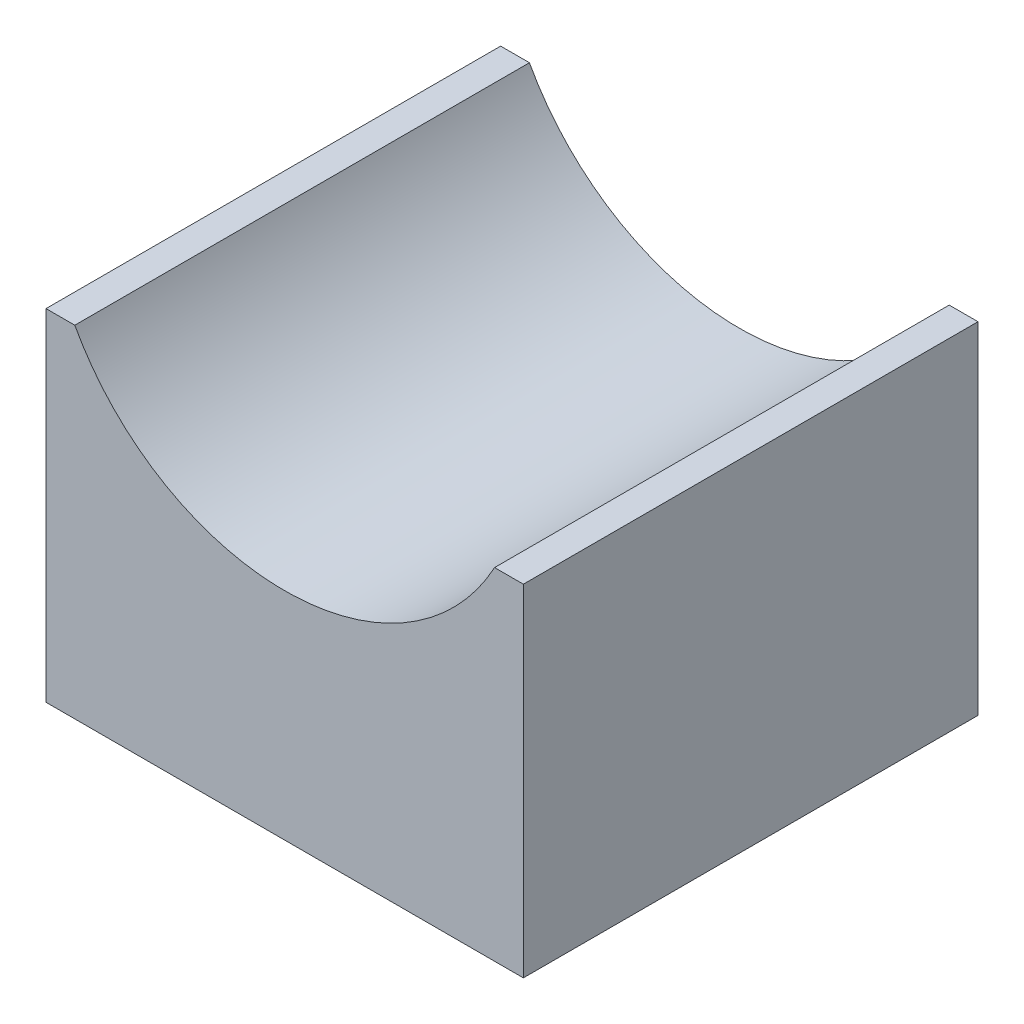
ISO-10303-21;
HEADER;
FILE_DESCRIPTION(('STEP AP214'),'2;1');
FILE_NAME('part.step','',(''),(''),'','','');
FILE_SCHEMA(('AUTOMOTIVE_DESIGN { 1 0 10303 214 1 1 1 1 }'));
ENDSEC;
DATA;
#1=APPLICATION_CONTEXT('core data for automotive mechanical design processes');
#2=APPLICATION_PROTOCOL_DEFINITION('international standard','automotive_design',2000,#1);
#3=PRODUCT_CONTEXT('',#1,'mechanical');
#4=PRODUCT('Part','Part','',(#3));
#5=PRODUCT_RELATED_PRODUCT_CATEGORY('part','',(#4));
#6=PRODUCT_DEFINITION_FORMATION('','',#4);
#7=PRODUCT_DEFINITION_CONTEXT('part definition',#1,'design');
#8=PRODUCT_DEFINITION('design','',#6,#7);
#9=PRODUCT_DEFINITION_SHAPE('','',#8);
#10=(LENGTH_UNIT() NAMED_UNIT(*) SI_UNIT(.MILLI.,.METRE.));
#11=(NAMED_UNIT(*) PLANE_ANGLE_UNIT() SI_UNIT($,.RADIAN.));
#12=(NAMED_UNIT(*) SI_UNIT($,.STERADIAN.) SOLID_ANGLE_UNIT());
#13=UNCERTAINTY_MEASURE_WITH_UNIT(LENGTH_MEASURE(1.E-05),#10,'distance_accuracy_value','');
#14=(GEOMETRIC_REPRESENTATION_CONTEXT(3) GLOBAL_UNCERTAINTY_ASSIGNED_CONTEXT((#13)) GLOBAL_UNIT_ASSIGNED_CONTEXT((#10,
#11,#12)) REPRESENTATION_CONTEXT('',''));
#15=CARTESIAN_POINT('',(0.,0.,0.));
#16=DIRECTION('',(0.,0.,1.));
#17=DIRECTION('',(1.,0.,0.));
#18=AXIS2_PLACEMENT_3D('',#15,#16,#17);
#19=CARTESIAN_POINT('',(0.,20.,10.));
#20=DIRECTION('',(0.,0.,-1.));
#21=DIRECTION('',(-1.,0.,0.));
#22=AXIS2_PLACEMENT_3D('',#19,#20,#21);
#23=CYLINDRICAL_SURFACE('',#22,10.5);
#24=CARTESIAN_POINT('',(0.,20.,-10.));
#25=DIRECTION('',(0.,0.,-1.));
#26=DIRECTION('',(1.,0.,0.));
#27=AXIS2_PLACEMENT_3D('',#24,#25,#26);
#28=CIRCLE('',#27,10.5);
#29=CARTESIAN_POINT('',(9.23309265630969,15.,-10.));
#30=VERTEX_POINT('',#29);
#31=CARTESIAN_POINT('',(-9.23309265630969,15.,-10.));
#32=VERTEX_POINT('',#31);
#33=EDGE_CURVE('E125',#30,#32,#28,.T.);
#34=ORIENTED_EDGE('',*,*,#33,.T.);
#35=DIRECTION('',(0.,0.,-1.));
#36=VECTOR('',#35,1.);
#37=CARTESIAN_POINT('',(-9.23309265630969,15.,10.));
#38=LINE('',#37,#36);
#39=CARTESIAN_POINT('',(-9.23309265630969,15.,10.));
#40=VERTEX_POINT('',#39);
#41=EDGE_CURVE('E11',#40,#32,#38,.T.);
#42=ORIENTED_EDGE('',*,*,#41,.F.);
#43=CARTESIAN_POINT('',(0.,20.,10.));
#44=DIRECTION('',(0.,0.,-1.));
#45=DIRECTION('',(1.,0.,0.));
#46=AXIS2_PLACEMENT_3D('',#43,#44,#45);
#47=CIRCLE('',#46,10.5);
#48=CARTESIAN_POINT('',(9.23309265630969,15.,10.));
#49=VERTEX_POINT('',#48);
#50=EDGE_CURVE('E135',#49,#40,#47,.T.);
#51=ORIENTED_EDGE('',*,*,#50,.F.);
#52=DIRECTION('',(0.,0.,-1.));
#53=VECTOR('',#52,1.);
#54=CARTESIAN_POINT('',(9.23309265630969,15.,10.));
#55=LINE('',#54,#53);
#56=EDGE_CURVE('E121',#49,#30,#55,.T.);
#57=ORIENTED_EDGE('',*,*,#56,.T.);
#58=EDGE_LOOP('',(#34,#42,#51,#57));
#59=FACE_BOUND('',#58,.T.);
#60=ADVANCED_FACE('F41',(#59),#23,.F.);
#61=CARTESIAN_POINT('',(-10.5,15.,10.));
#62=DIRECTION('',(0.,-1.,0.));
#63=DIRECTION('',(0.,0.,-1.));
#64=AXIS2_PLACEMENT_3D('',#61,#62,#63);
#65=PLANE('',#64);
#66=DIRECTION('',(-1.,0.,0.));
#67=VECTOR('',#66,1.);
#68=CARTESIAN_POINT('',(-10.5,15.,-10.));
#69=LINE('',#68,#67);
#70=CARTESIAN_POINT('',(-10.5,15.,-10.));
#71=VERTEX_POINT('',#70);
#72=EDGE_CURVE('E128',#32,#71,#69,.T.);
#73=ORIENTED_EDGE('',*,*,#72,.T.);
#74=DIRECTION('',(0.,0.,-1.));
#75=VECTOR('',#74,1.);
#76=CARTESIAN_POINT('',(-10.5,15.,10.));
#77=LINE('',#76,#75);
#78=CARTESIAN_POINT('',(-10.5,15.,10.));
#79=VERTEX_POINT('',#78);
#80=EDGE_CURVE('E49',#79,#71,#77,.T.);
#81=ORIENTED_EDGE('',*,*,#80,.F.);
#82=DIRECTION('',(-1.,0.,0.));
#83=VECTOR('',#82,1.);
#84=CARTESIAN_POINT('',(-10.5,15.,10.));
#85=LINE('',#84,#83);
#86=EDGE_CURVE('E94',#40,#79,#85,.T.);
#87=ORIENTED_EDGE('',*,*,#86,.F.);
#88=ORIENTED_EDGE('',*,*,#41,.T.);
#89=EDGE_LOOP('',(#73,#81,#87,#88));
#90=FACE_BOUND('',#89,.T.);
#91=ADVANCED_FACE('F159',(#90),#65,.F.);
#92=CARTESIAN_POINT('',(-10.5,15.,10.));
#93=DIRECTION('',(1.,0.,0.));
#94=DIRECTION('',(0.,0.,-1.));
#95=AXIS2_PLACEMENT_3D('',#92,#93,#94);
#96=PLANE('',#95);
#97=DIRECTION('',(0.,-1.,0.));
#98=VECTOR('',#97,1.);
#99=CARTESIAN_POINT('',(-10.5,15.,-10.));
#100=LINE('',#99,#98);
#101=CARTESIAN_POINT('',(-10.5,0.,-10.));
#102=VERTEX_POINT('',#101);
#103=EDGE_CURVE('E130',#71,#102,#100,.T.);
#104=ORIENTED_EDGE('',*,*,#103,.T.);
#105=DIRECTION('',(0.,0.,-1.));
#106=VECTOR('',#105,1.);
#107=CARTESIAN_POINT('',(-10.5,0.,10.));
#108=LINE('',#107,#106);
#109=CARTESIAN_POINT('',(-10.5,0.,10.));
#110=VERTEX_POINT('',#109);
#111=EDGE_CURVE('E116',#110,#102,#108,.T.);
#112=ORIENTED_EDGE('',*,*,#111,.F.);
#113=DIRECTION('',(0.,-1.,0.));
#114=VECTOR('',#113,1.);
#115=CARTESIAN_POINT('',(-10.5,15.,10.));
#116=LINE('',#115,#114);
#117=EDGE_CURVE('E107',#79,#110,#116,.T.);
#118=ORIENTED_EDGE('',*,*,#117,.F.);
#119=ORIENTED_EDGE('',*,*,#80,.T.);
#120=EDGE_LOOP('',(#104,#112,#118,#119));
#121=FACE_BOUND('',#120,.T.);
#122=ADVANCED_FACE('F141',(#121),#96,.F.);
#123=CARTESIAN_POINT('',(-10.5,0.,10.));
#124=DIRECTION('',(0.,1.,0.));
#125=DIRECTION('',(0.,0.,1.));
#126=AXIS2_PLACEMENT_3D('',#123,#124,#125);
#127=PLANE('',#126);
#128=DIRECTION('',(1.,0.,0.));
#129=VECTOR('',#128,1.);
#130=CARTESIAN_POINT('',(-10.5,0.,-10.));
#131=LINE('',#130,#129);
#132=CARTESIAN_POINT('',(10.5,0.,-10.));
#133=VERTEX_POINT('',#132);
#134=EDGE_CURVE('E115',#102,#133,#131,.T.);
#135=ORIENTED_EDGE('',*,*,#134,.T.);
#136=DIRECTION('',(0.,0.,-1.));
#137=VECTOR('',#136,1.);
#138=CARTESIAN_POINT('',(10.5,0.,10.));
#139=LINE('',#138,#137);
#140=CARTESIAN_POINT('',(10.5,0.,10.));
#141=VERTEX_POINT('',#140);
#142=EDGE_CURVE('E112',#141,#133,#139,.T.);
#143=ORIENTED_EDGE('',*,*,#142,.F.);
#144=DIRECTION('',(1.,0.,0.));
#145=VECTOR('',#144,1.);
#146=CARTESIAN_POINT('',(-10.5,0.,10.));
#147=LINE('',#146,#145);
#148=EDGE_CURVE('E101',#110,#141,#147,.T.);
#149=ORIENTED_EDGE('',*,*,#148,.F.);
#150=ORIENTED_EDGE('',*,*,#111,.T.);
#151=EDGE_LOOP('',(#135,#143,#149,#150));
#152=FACE_BOUND('',#151,.T.);
#153=ADVANCED_FACE('F113',(#152),#127,.F.);
#154=CARTESIAN_POINT('',(10.5,0.,10.));
#155=DIRECTION('',(-1.,0.,0.));
#156=DIRECTION('',(0.,-1.,0.));
#157=AXIS2_PLACEMENT_3D('',#154,#155,#156);
#158=PLANE('',#157);
#159=DIRECTION('',(0.,1.,0.));
#160=VECTOR('',#159,1.);
#161=CARTESIAN_POINT('',(10.5,0.,-10.));
#162=LINE('',#161,#160);
#163=CARTESIAN_POINT('',(10.5,15.,-10.));
#164=VERTEX_POINT('',#163);
#165=EDGE_CURVE('E80',#133,#164,#162,.T.);
#166=ORIENTED_EDGE('',*,*,#165,.T.);
#167=DIRECTION('',(0.,0.,-1.));
#168=VECTOR('',#167,1.);
#169=CARTESIAN_POINT('',(10.5,15.,10.));
#170=LINE('',#169,#168);
#171=CARTESIAN_POINT('',(10.5,15.,10.));
#172=VERTEX_POINT('',#171);
#173=EDGE_CURVE('E117',#172,#164,#170,.T.);
#174=ORIENTED_EDGE('',*,*,#173,.F.);
#175=DIRECTION('',(0.,1.,0.));
#176=VECTOR('',#175,1.);
#177=CARTESIAN_POINT('',(10.5,0.,10.));
#178=LINE('',#177,#176);
#179=EDGE_CURVE('E105',#141,#172,#178,.T.);
#180=ORIENTED_EDGE('',*,*,#179,.F.);
#181=ORIENTED_EDGE('',*,*,#142,.T.);
#182=EDGE_LOOP('',(#166,#174,#180,#181));
#183=FACE_BOUND('',#182,.T.);
#184=ADVANCED_FACE('F119',(#183),#158,.F.);
#185=CARTESIAN_POINT('',(9.23309265630969,15.,10.));
#186=DIRECTION('',(0.,-1.,0.));
#187=DIRECTION('',(0.,0.,-1.));
#188=AXIS2_PLACEMENT_3D('',#185,#186,#187);
#189=PLANE('',#188);
#190=DIRECTION('',(-1.,0.,0.));
#191=VECTOR('',#190,1.);
#192=CARTESIAN_POINT('',(9.23309265630969,15.,-10.));
#193=LINE('',#192,#191);
#194=EDGE_CURVE('E86',#164,#30,#193,.T.);
#195=ORIENTED_EDGE('',*,*,#194,.T.);
#196=ORIENTED_EDGE('',*,*,#56,.F.);
#197=DIRECTION('',(-1.,0.,0.));
#198=VECTOR('',#197,1.);
#199=CARTESIAN_POINT('',(9.23309265630969,15.,10.));
#200=LINE('',#199,#198);
#201=EDGE_CURVE('E57',#172,#49,#200,.T.);
#202=ORIENTED_EDGE('',*,*,#201,.F.);
#203=ORIENTED_EDGE('',*,*,#173,.T.);
#204=EDGE_LOOP('',(#195,#196,#202,#203));
#205=FACE_BOUND('',#204,.T.);
#206=ADVANCED_FACE('F148',(#205),#189,.F.);
#207=CARTESIAN_POINT('',(0.,20.,10.));
#208=DIRECTION('',(0.,0.,1.));
#209=DIRECTION('',(1.,0.,0.));
#210=AXIS2_PLACEMENT_3D('',#207,#208,#209);
#211=PLANE('',#210);
#212=ORIENTED_EDGE('',*,*,#50,.T.);
#213=ORIENTED_EDGE('',*,*,#86,.T.);
#214=ORIENTED_EDGE('',*,*,#117,.T.);
#215=ORIENTED_EDGE('',*,*,#148,.T.);
#216=ORIENTED_EDGE('',*,*,#179,.T.);
#217=ORIENTED_EDGE('',*,*,#201,.T.);
#218=EDGE_LOOP('',(#212,#213,#214,#215,#216,#217));
#219=FACE_BOUND('',#218,.T.);
#220=ADVANCED_FACE('F103',(#219),#211,.T.);
#221=CARTESIAN_POINT('',(0.,20.,-10.));
#222=DIRECTION('',(0.,0.,1.));
#223=DIRECTION('',(1.,0.,0.));
#224=AXIS2_PLACEMENT_3D('',#221,#222,#223);
#225=PLANE('',#224);
#226=ORIENTED_EDGE('',*,*,#33,.F.);
#227=ORIENTED_EDGE('',*,*,#194,.F.);
#228=ORIENTED_EDGE('',*,*,#165,.F.);
#229=ORIENTED_EDGE('',*,*,#134,.F.);
#230=ORIENTED_EDGE('',*,*,#103,.F.);
#231=ORIENTED_EDGE('',*,*,#72,.F.);
#232=EDGE_LOOP('',(#226,#227,#228,#229,#230,#231));
#233=FACE_BOUND('',#232,.T.);
#234=ADVANCED_FACE('F144',(#233),#225,.F.);
#235=CLOSED_SHELL('',(#60,#91,#122,#153,#184,#206,#220,#234));
#236=MANIFOLD_SOLID_BREP('B2',#235);
#237=ADVANCED_BREP_SHAPE_REPRESENTATION('',(#18,#236),#14);
#238=SHAPE_DEFINITION_REPRESENTATION(#9,#237);
ENDSEC;
END-ISO-10303-21;
